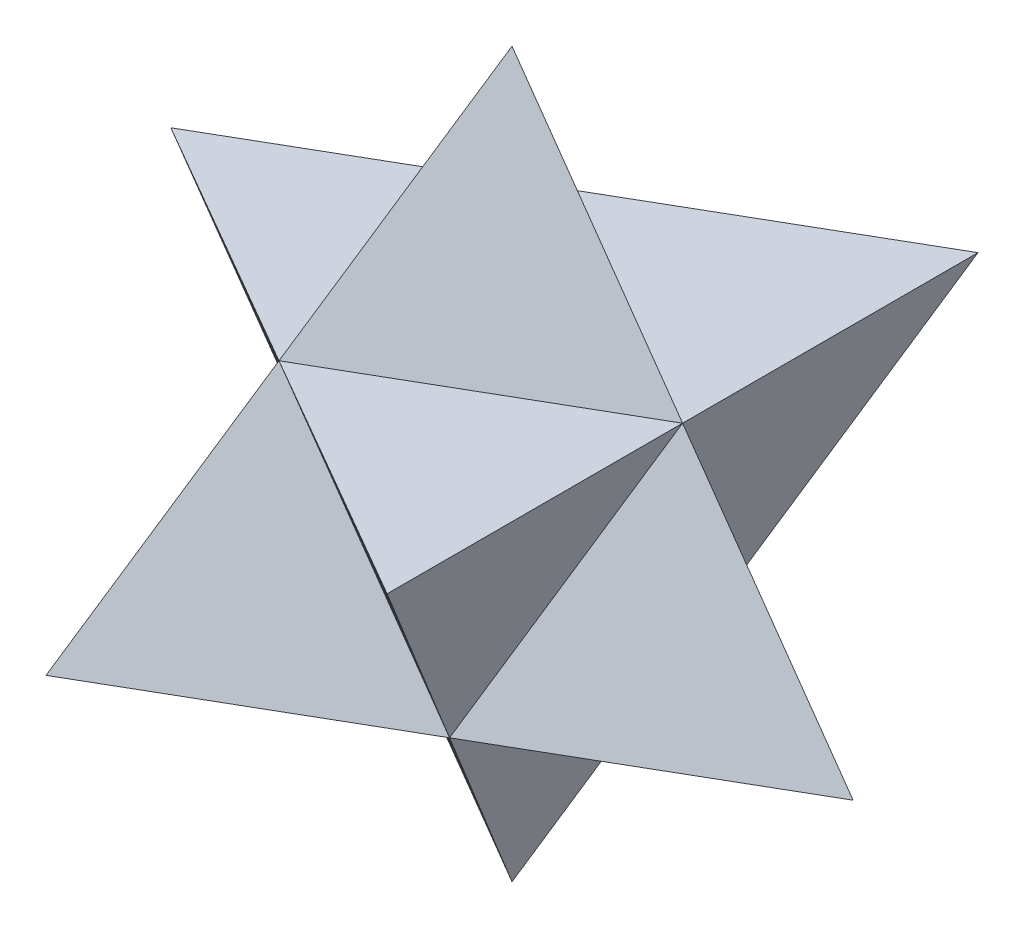
ISO-10303-21;
HEADER;
FILE_DESCRIPTION(('STEP AP214'),'2;1');
FILE_NAME('part.step','',(''),(''),'','','');
FILE_SCHEMA(('AUTOMOTIVE_DESIGN { 1 0 10303 214 1 1 1 1 }'));
ENDSEC;
DATA;
#1=APPLICATION_CONTEXT('core data for automotive mechanical design processes');
#2=APPLICATION_PROTOCOL_DEFINITION('international standard','automotive_design',2000,#1);
#3=PRODUCT_CONTEXT('',#1,'mechanical');
#4=PRODUCT('Part','Part','',(#3));
#5=PRODUCT_RELATED_PRODUCT_CATEGORY('part','',(#4));
#6=PRODUCT_DEFINITION_FORMATION('','',#4);
#7=PRODUCT_DEFINITION_CONTEXT('part definition',#1,'design');
#8=PRODUCT_DEFINITION('design','',#6,#7);
#9=PRODUCT_DEFINITION_SHAPE('','',#8);
#10=(LENGTH_UNIT() NAMED_UNIT(*) SI_UNIT(.MILLI.,.METRE.));
#11=(NAMED_UNIT(*) PLANE_ANGLE_UNIT() SI_UNIT($,.RADIAN.));
#12=(NAMED_UNIT(*) SI_UNIT($,.STERADIAN.) SOLID_ANGLE_UNIT());
#13=UNCERTAINTY_MEASURE_WITH_UNIT(LENGTH_MEASURE(1.E-05),#10,'distance_accuracy_value','');
#14=(GEOMETRIC_REPRESENTATION_CONTEXT(3) GLOBAL_UNCERTAINTY_ASSIGNED_CONTEXT((#13)) GLOBAL_UNIT_ASSIGNED_CONTEXT((#10,
#11,#12)) REPRESENTATION_CONTEXT('',''));
#15=CARTESIAN_POINT('',(0.,0.,0.));
#16=DIRECTION('',(0.,0.,1.));
#17=DIRECTION('',(1.,0.,0.));
#18=AXIS2_PLACEMENT_3D('',#15,#16,#17);
#19=CARTESIAN_POINT('',(-14.142135623731,-10.,24.4948974278318));
#20=DIRECTION('',(0.471404520791032,0.333333333333334,0.816496580927726));
#21=DIRECTION('',(0.866025403784439,0.,-0.5));
#22=AXIS2_PLACEMENT_3D('',#19,#20,#21);
#23=PLANE('',#22);
#24=DIRECTION('',(0.577350269189627,-0.816496580927725,0.));
#25=VECTOR('',#24,1.);
#26=CARTESIAN_POINT('',(0.,0.,12.2474487139159));
#27=LINE('',#26,#25);
#28=CARTESIAN_POINT('',(-7.07106781186546,10.,12.2474487139159));
#29=VERTEX_POINT('',#28);
#30=CARTESIAN_POINT('',(7.07106781186546,-10.,12.2474487139159));
#31=VERTEX_POINT('',#30);
#32=EDGE_CURVE('E160',#29,#31,#27,.T.);
#33=ORIENTED_EDGE('',*,*,#32,.F.);
#34=DIRECTION('',(-0.288675134594813,-0.816496580927725,0.500000000000001));
#35=VECTOR('',#34,1.);
#36=CARTESIAN_POINT('',(-14.142135623731,-10.,24.4948974278318));
#37=LINE('',#36,#35);
#38=CARTESIAN_POINT('',(-14.142135623731,-10.,24.4948974278318));
#39=VERTEX_POINT('',#38);
#40=EDGE_CURVE('E185',#29,#39,#37,.T.);
#41=ORIENTED_EDGE('',*,*,#40,.T.);
#42=DIRECTION('',(0.866025403784439,0.,-0.5));
#43=VECTOR('',#42,1.);
#44=CARTESIAN_POINT('',(-14.142135623731,-10.,24.4948974278318));
#45=LINE('',#44,#43);
#46=EDGE_CURVE('E64',#39,#31,#45,.T.);
#47=ORIENTED_EDGE('',*,*,#46,.T.);
#48=EDGE_LOOP('',(#33,#41,#47));
#49=FACE_BOUND('',#48,.T.);
#50=ADVANCED_FACE('F41',(#49),#23,.T.);
#51=CARTESIAN_POINT('',(-14.1421356237309,-10.,-24.4948974278318));
#52=DIRECTION('',(-0.942809041582063,0.333333333333334,0.));
#53=DIRECTION('',(-0.333333333333334,-0.942809041582063,0.));
#54=AXIS2_PLACEMENT_3D('',#51,#52,#53);
#55=PLANE('',#54);
#56=DIRECTION('',(0.288675134594813,0.816496580927725,0.500000000000001));
#57=VECTOR('',#56,1.);
#58=CARTESIAN_POINT('',(-17.6776695296637,-20.,-6.12372435695797));
#59=LINE('',#58,#57);
#60=CARTESIAN_POINT('',(-14.1421356237309,-10.,0.));
#61=VERTEX_POINT('',#60);
#62=EDGE_CURVE('E105',#61,#29,#59,.T.);
#63=ORIENTED_EDGE('',*,*,#62,.F.);
#64=DIRECTION('',(0.,0.,1.));
#65=VECTOR('',#64,1.);
#66=CARTESIAN_POINT('',(-14.1421356237309,-10.,-24.4948974278318));
#67=LINE('',#66,#65);
#68=EDGE_CURVE('E180',#61,#39,#67,.T.);
#69=ORIENTED_EDGE('',*,*,#68,.T.);
#70=ORIENTED_EDGE('',*,*,#40,.F.);
#71=EDGE_LOOP('',(#63,#69,#70));
#72=FACE_BOUND('',#71,.T.);
#73=ADVANCED_FACE('F280',(#72),#55,.T.);
#74=CARTESIAN_POINT('',(0.,-10.,0.));
#75=DIRECTION('',(0.,1.,0.));
#76=DIRECTION('',(0.,0.,1.));
#77=AXIS2_PLACEMENT_3D('',#74,#75,#76);
#78=PLANE('',#77);
#79=DIRECTION('',(0.866025403784439,0.,0.5));
#80=VECTOR('',#79,1.);
#81=CARTESIAN_POINT('',(-3.53553390593273,-10.,6.12372435695793));
#82=LINE('',#81,#80);
#83=EDGE_CURVE('E50',#31,#61,#82,.F.);
#84=ORIENTED_EDGE('',*,*,#83,.F.);
#85=ORIENTED_EDGE('',*,*,#46,.F.);
#86=ORIENTED_EDGE('',*,*,#68,.F.);
#87=EDGE_LOOP('',(#84,#85,#86));
#88=FACE_BOUND('',#87,.T.);
#89=ADVANCED_FACE('F286',(#88),#78,.F.);
#90=CARTESIAN_POINT('',(14.1421356237309,10.,-24.4948974278318));
#91=DIRECTION('',(0.942809041582063,-0.333333333333334,0.));
#92=DIRECTION('',(0.333333333333334,0.942809041582063,0.));
#93=AXIS2_PLACEMENT_3D('',#90,#91,#92);
#94=PLANE('',#93);
#95=DIRECTION('',(0.288675134594813,0.816496580927725,-0.500000000000001));
#96=VECTOR('',#95,1.);
#97=CARTESIAN_POINT('',(14.1421356237309,10.,-24.4948974278318));
#98=LINE('',#97,#96);
#99=CARTESIAN_POINT('',(0.,-30.,0.));
#100=VERTEX_POINT('',#99);
#101=CARTESIAN_POINT('',(7.07106781186545,-10.,-12.2474487139159));
#102=VERTEX_POINT('',#101);
#103=EDGE_CURVE('E118',#100,#102,#98,.T.);
#104=ORIENTED_EDGE('',*,*,#103,.T.);
#105=DIRECTION('',(0.,0.,-1.));
#106=VECTOR('',#105,1.);
#107=CARTESIAN_POINT('',(7.07106781186545,-10.,0.));
#108=LINE('',#107,#106);
#109=EDGE_CURVE('E190',#102,#31,#108,.F.);
#110=ORIENTED_EDGE('',*,*,#109,.T.);
#111=DIRECTION('',(0.288675134594813,0.816496580927725,0.500000000000001));
#112=VECTOR('',#111,1.);
#113=CARTESIAN_POINT('',(14.142135623731,10.,24.4948974278318));
#114=LINE('',#113,#112);
#115=EDGE_CURVE('E137',#100,#31,#114,.T.);
#116=ORIENTED_EDGE('',*,*,#115,.F.);
#117=EDGE_LOOP('',(#104,#110,#116));
#118=FACE_BOUND('',#117,.T.);
#119=ADVANCED_FACE('F222',(#118),#94,.T.);
#120=CARTESIAN_POINT('',(-28.2842712474619,10.,0.));
#121=DIRECTION('',(-0.471404520791032,-0.333333333333334,-0.816496580927726));
#122=DIRECTION('',(0.866025403784439,0.,-0.5));
#123=AXIS2_PLACEMENT_3D('',#120,#121,#122);
#124=PLANE('',#123);
#125=DIRECTION('',(-0.577350269189627,0.816496580927725,0.));
#126=VECTOR('',#125,1.);
#127=CARTESIAN_POINT('',(-28.2842712474619,10.,0.));
#128=LINE('',#127,#126);
#129=EDGE_CURVE('E117',#100,#61,#128,.T.);
#130=ORIENTED_EDGE('',*,*,#129,.T.);
#131=DIRECTION('',(-0.866025403784439,0.,0.5));
#132=VECTOR('',#131,1.);
#133=CARTESIAN_POINT('',(-3.53553390593273,-10.,-6.12372435695793));
#134=LINE('',#133,#132);
#135=EDGE_CURVE('E204',#61,#102,#134,.F.);
#136=ORIENTED_EDGE('',*,*,#135,.T.);
#137=ORIENTED_EDGE('',*,*,#103,.F.);
#138=EDGE_LOOP('',(#130,#136,#137));
#139=FACE_BOUND('',#138,.T.);
#140=ADVANCED_FACE('F218',(#139),#124,.T.);
#141=CARTESIAN_POINT('',(14.142135623731,10.,24.4948974278318));
#142=DIRECTION('',(-0.471404520791032,-0.333333333333334,0.816496580927726));
#143=DIRECTION('',(-0.866025403784439,0.,-0.5));
#144=AXIS2_PLACEMENT_3D('',#141,#142,#143);
#145=PLANE('',#144);
#146=ORIENTED_EDGE('',*,*,#115,.T.);
#147=ORIENTED_EDGE('',*,*,#83,.T.);
#148=ORIENTED_EDGE('',*,*,#129,.F.);
#149=EDGE_LOOP('',(#146,#147,#148));
#150=FACE_BOUND('',#149,.T.);
#151=ADVANCED_FACE('F211',(#150),#145,.T.);
#152=ORIENTED_EDGE('',*,*,#109,.F.);
#153=DIRECTION('',(-0.866025403784438,0.,-0.5));
#154=VECTOR('',#153,1.);
#155=CARTESIAN_POINT('',(28.2842712474619,-10.,0.));
#156=LINE('',#155,#154);
#157=CARTESIAN_POINT('',(28.2842712474619,-10.,0.));
#158=VERTEX_POINT('',#157);
#159=EDGE_CURVE('E176',#158,#102,#156,.T.);
#160=ORIENTED_EDGE('',*,*,#159,.F.);
#161=EDGE_CURVE('E172',#31,#158,#45,.T.);
#162=ORIENTED_EDGE('',*,*,#161,.F.);
#163=EDGE_LOOP('',(#152,#160,#162));
#164=FACE_BOUND('',#163,.T.);
#165=ADVANCED_FACE('F226',(#164),#78,.F.);
#166=CARTESIAN_POINT('',(28.2842712474619,-10.,0.));
#167=DIRECTION('',(0.471404520791032,0.333333333333334,-0.816496580927726));
#168=DIRECTION('',(-0.866025403784439,0.,-0.5));
#169=AXIS2_PLACEMENT_3D('',#166,#167,#168);
#170=PLANE('',#169);
#171=DIRECTION('',(-0.288675134594813,-0.816496580927725,-0.500000000000001));
#172=VECTOR('',#171,1.);
#173=CARTESIAN_POINT('',(10.6066017177982,0.,-6.12372435695793));
#174=LINE('',#173,#172);
#175=CARTESIAN_POINT('',(14.1421356237309,10.,0.));
#176=VERTEX_POINT('',#175);
#177=EDGE_CURVE('E136',#176,#102,#174,.T.);
#178=ORIENTED_EDGE('',*,*,#177,.F.);
#179=DIRECTION('',(0.577350269189627,-0.816496580927725,0.));
#180=VECTOR('',#179,1.);
#181=CARTESIAN_POINT('',(28.2842712474619,-10.,0.));
#182=LINE('',#181,#180);
#183=EDGE_CURVE('E191',#176,#158,#182,.T.);
#184=ORIENTED_EDGE('',*,*,#183,.T.);
#185=ORIENTED_EDGE('',*,*,#159,.T.);
#186=EDGE_LOOP('',(#178,#184,#185));
#187=FACE_BOUND('',#186,.T.);
#188=ADVANCED_FACE('F230',(#187),#170,.T.);
#189=DIRECTION('',(0.288675134594813,0.816496580927725,-0.500000000000001));
#190=VECTOR('',#189,1.);
#191=CARTESIAN_POINT('',(3.53553390593272,-20.,18.3711730708739));
#192=LINE('',#191,#190);
#193=EDGE_CURVE('E148',#31,#176,#192,.T.);
#194=ORIENTED_EDGE('',*,*,#193,.F.);
#195=ORIENTED_EDGE('',*,*,#161,.T.);
#196=ORIENTED_EDGE('',*,*,#183,.F.);
#197=EDGE_LOOP('',(#194,#195,#196));
#198=FACE_BOUND('',#197,.T.);
#199=ADVANCED_FACE('F235',(#198),#23,.T.);
#200=ORIENTED_EDGE('',*,*,#135,.F.);
#201=CARTESIAN_POINT('',(-14.1421356237309,-10.,-24.4948974278318));
#202=VERTEX_POINT('',#201);
#203=EDGE_CURVE('E181',#202,#61,#67,.T.);
#204=ORIENTED_EDGE('',*,*,#203,.F.);
#205=EDGE_CURVE('E175',#102,#202,#156,.T.);
#206=ORIENTED_EDGE('',*,*,#205,.F.);
#207=EDGE_LOOP('',(#200,#204,#206));
#208=FACE_BOUND('',#207,.T.);
#209=ADVANCED_FACE('F271',(#208),#78,.F.);
#210=DIRECTION('',(-0.288675134594814,-0.816496580927725,0.500000000000001));
#211=VECTOR('',#210,1.);
#212=CARTESIAN_POINT('',(-10.6066017177982,0.,-6.12372435695796));
#213=LINE('',#212,#211);
#214=CARTESIAN_POINT('',(-7.07106781186545,10.,-12.2474487139159));
#215=VERTEX_POINT('',#214);
#216=EDGE_CURVE('E115',#215,#61,#213,.T.);
#217=ORIENTED_EDGE('',*,*,#216,.F.);
#218=DIRECTION('',(-0.288675134594813,-0.816496580927725,-0.500000000000001));
#219=VECTOR('',#218,1.);
#220=CARTESIAN_POINT('',(-14.1421356237309,-10.,-24.4948974278318));
#221=LINE('',#220,#219);
#222=EDGE_CURVE('E196',#215,#202,#221,.T.);
#223=ORIENTED_EDGE('',*,*,#222,.T.);
#224=ORIENTED_EDGE('',*,*,#203,.T.);
#225=EDGE_LOOP('',(#217,#223,#224));
#226=FACE_BOUND('',#225,.T.);
#227=ADVANCED_FACE('F277',(#226),#55,.T.);
#228=DIRECTION('',(-0.577350269189626,0.816496580927725,0.));
#229=VECTOR('',#228,1.);
#230=CARTESIAN_POINT('',(14.142135623731,-20.,-12.2474487139159));
#231=LINE('',#230,#229);
#232=EDGE_CURVE('E154',#102,#215,#231,.T.);
#233=ORIENTED_EDGE('',*,*,#232,.F.);
#234=ORIENTED_EDGE('',*,*,#205,.T.);
#235=ORIENTED_EDGE('',*,*,#222,.F.);
#236=EDGE_LOOP('',(#233,#234,#235));
#237=FACE_BOUND('',#236,.T.);
#238=ADVANCED_FACE('F43',(#237),#170,.T.);
#239=CARTESIAN_POINT('',(0.,10.,0.));
#240=DIRECTION('',(0.,-1.,0.));
#241=DIRECTION('',(0.,0.,1.));
#242=AXIS2_PLACEMENT_3D('',#239,#240,#241);
#243=PLANE('',#242);
#244=DIRECTION('',(-0.866025403784439,0.,-0.5));
#245=VECTOR('',#244,1.);
#246=CARTESIAN_POINT('',(14.142135623731,10.,24.4948974278318));
#247=LINE('',#246,#245);
#248=CARTESIAN_POINT('',(-28.2842712474619,10.,0.));
#249=VERTEX_POINT('',#248);
#250=EDGE_CURVE('E56',#29,#249,#247,.T.);
#251=ORIENTED_EDGE('',*,*,#250,.F.);
#252=DIRECTION('',(0.,0.,1.));
#253=VECTOR('',#252,1.);
#254=CARTESIAN_POINT('',(-7.07106781186544,10.,-24.4948974278318));
#255=LINE('',#254,#253);
#256=EDGE_CURVE('E11',#29,#215,#255,.F.);
#257=ORIENTED_EDGE('',*,*,#256,.T.);
#258=DIRECTION('',(0.866025403784438,0.,-0.5));
#259=VECTOR('',#258,1.);
#260=CARTESIAN_POINT('',(-28.2842712474619,10.,0.));
#261=LINE('',#260,#259);
#262=EDGE_CURVE('E113',#249,#215,#261,.T.);
#263=ORIENTED_EDGE('',*,*,#262,.F.);
#264=EDGE_LOOP('',(#251,#257,#263));
#265=FACE_BOUND('',#264,.T.);
#266=ADVANCED_FACE('F120',(#265),#243,.F.);
#267=ORIENTED_EDGE('',*,*,#262,.T.);
#268=ORIENTED_EDGE('',*,*,#216,.T.);
#269=EDGE_CURVE('E103',#61,#249,#128,.T.);
#270=ORIENTED_EDGE('',*,*,#269,.T.);
#271=EDGE_LOOP('',(#267,#268,#270));
#272=FACE_BOUND('',#271,.T.);
#273=ADVANCED_FACE('F112',(#272),#124,.T.);
#274=ORIENTED_EDGE('',*,*,#269,.F.);
#275=ORIENTED_EDGE('',*,*,#62,.T.);
#276=ORIENTED_EDGE('',*,*,#250,.T.);
#277=EDGE_LOOP('',(#274,#275,#276));
#278=FACE_BOUND('',#277,.T.);
#279=ADVANCED_FACE('F102',(#278),#145,.T.);
#280=ORIENTED_EDGE('',*,*,#256,.F.);
#281=CARTESIAN_POINT('',(0.,30.,0.));
#282=VERTEX_POINT('',#281);
#283=EDGE_CURVE('E192',#282,#29,#37,.T.);
#284=ORIENTED_EDGE('',*,*,#283,.F.);
#285=EDGE_CURVE('E197',#282,#215,#221,.T.);
#286=ORIENTED_EDGE('',*,*,#285,.T.);
#287=EDGE_LOOP('',(#280,#284,#286));
#288=FACE_BOUND('',#287,.T.);
#289=ADVANCED_FACE('F279',(#288),#55,.T.);
#290=DIRECTION('',(-0.866025403784439,0.,-0.5));
#291=VECTOR('',#290,1.);
#292=CARTESIAN_POINT('',(24.7487373415292,10.,6.12372435695796));
#293=LINE('',#292,#291);
#294=EDGE_CURVE('E164',#215,#176,#293,.F.);
#295=ORIENTED_EDGE('',*,*,#294,.F.);
#296=ORIENTED_EDGE('',*,*,#285,.F.);
#297=EDGE_CURVE('E186',#282,#176,#182,.T.);
#298=ORIENTED_EDGE('',*,*,#297,.T.);
#299=EDGE_LOOP('',(#295,#296,#298));
#300=FACE_BOUND('',#299,.T.);
#301=ADVANCED_FACE('F257',(#300),#170,.T.);
#302=DIRECTION('',(0.866025403784439,0.,-0.5));
#303=VECTOR('',#302,1.);
#304=CARTESIAN_POINT('',(-17.6776695296637,10.,18.3711730708738));
#305=LINE('',#304,#303);
#306=EDGE_CURVE('E168',#176,#29,#305,.F.);
#307=ORIENTED_EDGE('',*,*,#306,.F.);
#308=ORIENTED_EDGE('',*,*,#297,.F.);
#309=ORIENTED_EDGE('',*,*,#283,.T.);
#310=EDGE_LOOP('',(#307,#308,#309));
#311=FACE_BOUND('',#310,.T.);
#312=ADVANCED_FACE('F253',(#311),#23,.T.);
#313=CARTESIAN_POINT('',(14.1421356237309,10.,-24.4948974278318));
#314=VERTEX_POINT('',#313);
#315=EDGE_CURVE('E123',#215,#314,#261,.T.);
#316=ORIENTED_EDGE('',*,*,#315,.F.);
#317=ORIENTED_EDGE('',*,*,#294,.T.);
#318=DIRECTION('',(0.,0.,1.));
#319=VECTOR('',#318,1.);
#320=CARTESIAN_POINT('',(14.1421356237309,10.,-24.4948974278318));
#321=LINE('',#320,#319);
#322=EDGE_CURVE('E128',#314,#176,#321,.T.);
#323=ORIENTED_EDGE('',*,*,#322,.F.);
#324=EDGE_LOOP('',(#316,#317,#323));
#325=FACE_BOUND('',#324,.T.);
#326=ADVANCED_FACE('F260',(#325),#243,.F.);
#327=ORIENTED_EDGE('',*,*,#322,.T.);
#328=ORIENTED_EDGE('',*,*,#177,.T.);
#329=EDGE_CURVE('E141',#102,#314,#98,.T.);
#330=ORIENTED_EDGE('',*,*,#329,.T.);
#331=EDGE_LOOP('',(#327,#328,#330));
#332=FACE_BOUND('',#331,.T.);
#333=ADVANCED_FACE('F262',(#332),#94,.T.);
#334=ORIENTED_EDGE('',*,*,#329,.F.);
#335=ORIENTED_EDGE('',*,*,#232,.T.);
#336=ORIENTED_EDGE('',*,*,#315,.T.);
#337=EDGE_LOOP('',(#334,#335,#336));
#338=FACE_BOUND('',#337,.T.);
#339=ADVANCED_FACE('F264',(#338),#124,.T.);
#340=CARTESIAN_POINT('',(14.142135623731,10.,24.4948974278318));
#341=VERTEX_POINT('',#340);
#342=EDGE_CURVE('E122',#176,#341,#321,.T.);
#343=ORIENTED_EDGE('',*,*,#342,.F.);
#344=ORIENTED_EDGE('',*,*,#306,.T.);
#345=EDGE_CURVE('E108',#341,#29,#247,.T.);
#346=ORIENTED_EDGE('',*,*,#345,.F.);
#347=EDGE_LOOP('',(#343,#344,#346));
#348=FACE_BOUND('',#347,.T.);
#349=ADVANCED_FACE('F249',(#348),#243,.F.);
#350=ORIENTED_EDGE('',*,*,#345,.T.);
#351=ORIENTED_EDGE('',*,*,#32,.T.);
#352=EDGE_CURVE('E132',#31,#341,#114,.T.);
#353=ORIENTED_EDGE('',*,*,#352,.T.);
#354=EDGE_LOOP('',(#350,#351,#353));
#355=FACE_BOUND('',#354,.T.);
#356=ADVANCED_FACE('F243',(#355),#145,.T.);
#357=ORIENTED_EDGE('',*,*,#352,.F.);
#358=ORIENTED_EDGE('',*,*,#193,.T.);
#359=ORIENTED_EDGE('',*,*,#342,.T.);
#360=EDGE_LOOP('',(#357,#358,#359));
#361=FACE_BOUND('',#360,.T.);
#362=ADVANCED_FACE('F247',(#361),#94,.T.);
#363=CLOSED_SHELL('',(#50,#73,#89,#119,#140,#151,#165,#188,#199,#209,#227,#238,#266,#273,#279,
#289,#301,#312,#326,#333,#339,#349,#356,#362));
#364=MANIFOLD_SOLID_BREP('B2',#363);
#365=ADVANCED_BREP_SHAPE_REPRESENTATION('',(#18,#364),#14);
#366=SHAPE_DEFINITION_REPRESENTATION(#9,#365);
ENDSEC;
END-ISO-10303-21;
